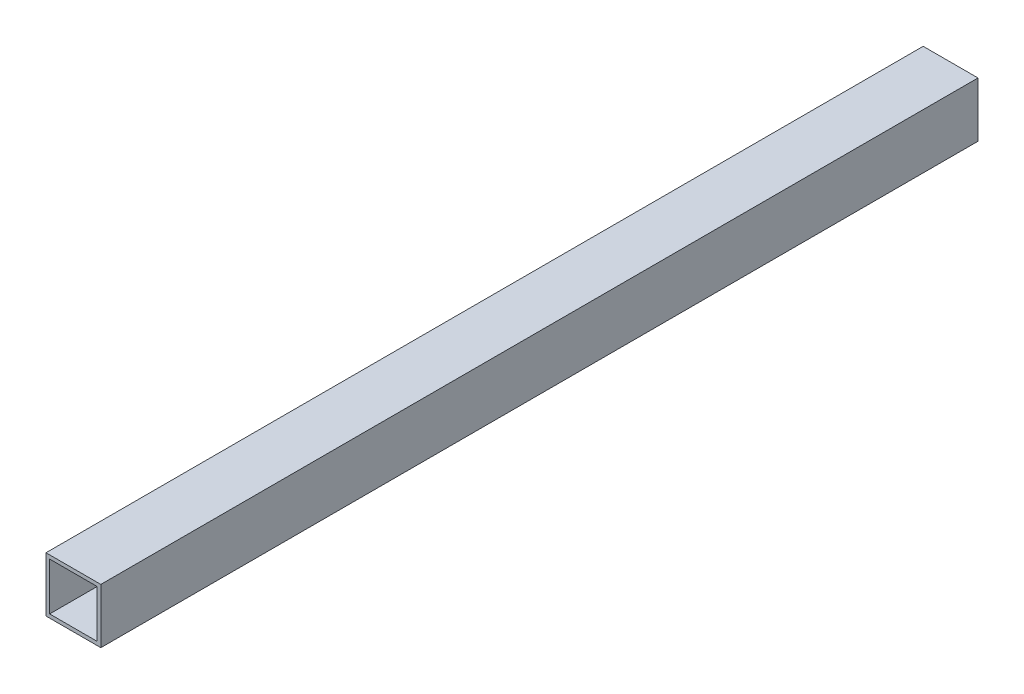
ISO-10303-21;
HEADER;
FILE_DESCRIPTION(('STEP AP214'),'2;1');
FILE_NAME('part.step','',(''),(''),'','','');
FILE_SCHEMA(('AUTOMOTIVE_DESIGN { 1 0 10303 214 1 1 1 1 }'));
ENDSEC;
DATA;
#1=APPLICATION_CONTEXT('core data for automotive mechanical design processes');
#2=APPLICATION_PROTOCOL_DEFINITION('international standard','automotive_design',2000,#1);
#3=PRODUCT_CONTEXT('',#1,'mechanical');
#4=PRODUCT('Part','Part','',(#3));
#5=PRODUCT_RELATED_PRODUCT_CATEGORY('part','',(#4));
#6=PRODUCT_DEFINITION_FORMATION('','',#4);
#7=PRODUCT_DEFINITION_CONTEXT('part definition',#1,'design');
#8=PRODUCT_DEFINITION('design','',#6,#7);
#9=PRODUCT_DEFINITION_SHAPE('','',#8);
#10=(LENGTH_UNIT() NAMED_UNIT(*) SI_UNIT(.MILLI.,.METRE.));
#11=(NAMED_UNIT(*) PLANE_ANGLE_UNIT() SI_UNIT($,.RADIAN.));
#12=(NAMED_UNIT(*) SI_UNIT($,.STERADIAN.) SOLID_ANGLE_UNIT());
#13=UNCERTAINTY_MEASURE_WITH_UNIT(LENGTH_MEASURE(1.E-05),#10,'distance_accuracy_value','');
#14=(GEOMETRIC_REPRESENTATION_CONTEXT(3) GLOBAL_UNCERTAINTY_ASSIGNED_CONTEXT((#13)) GLOBAL_UNIT_ASSIGNED_CONTEXT((#10,
#11,#12)) REPRESENTATION_CONTEXT('',''));
#15=CARTESIAN_POINT('',(0.,0.,0.));
#16=DIRECTION('',(0.,0.,1.));
#17=DIRECTION('',(1.,0.,0.));
#18=AXIS2_PLACEMENT_3D('',#15,#16,#17);
#19=CARTESIAN_POINT('',(9.525,-9.525,-1524.));
#20=DIRECTION('',(0.,0.,1.));
#21=DIRECTION('',(1.,0.,0.));
#22=AXIS2_PLACEMENT_3D('',#19,#20,#21);
#23=PLANE('',#22);
#24=DIRECTION('',(0.,1.,0.));
#25=VECTOR('',#24,1.);
#26=CARTESIAN_POINT('',(9.525,9.525,-1524.));
#27=LINE('',#26,#25);
#28=CARTESIAN_POINT('',(9.525,-9.525,-1524.));
#29=VERTEX_POINT('',#28);
#30=CARTESIAN_POINT('',(9.525,9.525,-1524.));
#31=VERTEX_POINT('',#30);
#32=EDGE_CURVE('E135',#29,#31,#27,.T.);
#33=ORIENTED_EDGE('',*,*,#32,.F.);
#34=DIRECTION('',(1.,0.,0.));
#35=VECTOR('',#34,1.);
#36=CARTESIAN_POINT('',(-9.525,-9.525,-1524.));
#37=LINE('',#36,#35);
#38=CARTESIAN_POINT('',(-9.525,-9.525,-1524.));
#39=VERTEX_POINT('',#38);
#40=EDGE_CURVE('E129',#39,#29,#37,.T.);
#41=ORIENTED_EDGE('',*,*,#40,.F.);
#42=DIRECTION('',(0.,-1.,0.));
#43=VECTOR('',#42,1.);
#44=CARTESIAN_POINT('',(-9.525,9.525,-1524.));
#45=LINE('',#44,#43);
#46=CARTESIAN_POINT('',(-9.525,9.525,-1524.));
#47=VERTEX_POINT('',#46);
#48=EDGE_CURVE('E132',#47,#39,#45,.T.);
#49=ORIENTED_EDGE('',*,*,#48,.F.);
#50=DIRECTION('',(-1.,0.,0.));
#51=VECTOR('',#50,1.);
#52=CARTESIAN_POINT('',(-9.525,9.525,-1524.));
#53=LINE('',#52,#51);
#54=EDGE_CURVE('E122',#31,#47,#53,.T.);
#55=ORIENTED_EDGE('',*,*,#54,.F.);
#56=EDGE_LOOP('',(#33,#41,#49,#55));
#57=FACE_BOUND('',#56,.T.);
#58=DIRECTION('',(0.,1.,0.));
#59=VECTOR('',#58,1.);
#60=CARTESIAN_POINT('',(8.255,8.255,-1524.));
#61=LINE('',#60,#59);
#62=CARTESIAN_POINT('',(8.255,-8.255,-1524.));
#63=VERTEX_POINT('',#62);
#64=CARTESIAN_POINT('',(8.255,8.255,-1524.));
#65=VERTEX_POINT('',#64);
#66=EDGE_CURVE('E155',#63,#65,#61,.T.);
#67=ORIENTED_EDGE('',*,*,#66,.T.);
#68=DIRECTION('',(-1.,0.,0.));
#69=VECTOR('',#68,1.);
#70=CARTESIAN_POINT('',(-8.255,8.255,-1524.));
#71=LINE('',#70,#69);
#72=CARTESIAN_POINT('',(-8.255,8.255,-1524.));
#73=VERTEX_POINT('',#72);
#74=EDGE_CURVE('E152',#65,#73,#71,.T.);
#75=ORIENTED_EDGE('',*,*,#74,.T.);
#76=DIRECTION('',(0.,-1.,0.));
#77=VECTOR('',#76,1.);
#78=CARTESIAN_POINT('',(-8.255,8.255,-1524.));
#79=LINE('',#78,#77);
#80=CARTESIAN_POINT('',(-8.255,-8.255,-1524.));
#81=VERTEX_POINT('',#80);
#82=EDGE_CURVE('E149',#73,#81,#79,.T.);
#83=ORIENTED_EDGE('',*,*,#82,.T.);
#84=DIRECTION('',(1.,0.,0.));
#85=VECTOR('',#84,1.);
#86=CARTESIAN_POINT('',(-8.255,-8.255,-1524.));
#87=LINE('',#86,#85);
#88=EDGE_CURVE('E146',#81,#63,#87,.T.);
#89=ORIENTED_EDGE('',*,*,#88,.T.);
#90=EDGE_LOOP('',(#67,#75,#83,#89));
#91=FACE_BOUND('',#90,.T.);
#92=ADVANCED_FACE('F40',(#57,#91),#23,.F.);
#93=CARTESIAN_POINT('',(9.525,9.525,1524.));
#94=DIRECTION('',(-1.,0.,0.));
#95=DIRECTION('',(0.,0.,1.));
#96=AXIS2_PLACEMENT_3D('',#93,#94,#95);
#97=PLANE('',#96);
#98=DIRECTION('',(0.,0.,-1.));
#99=VECTOR('',#98,1.);
#100=CARTESIAN_POINT('',(9.525,9.525,1524.));
#101=LINE('',#100,#99);
#102=CARTESIAN_POINT('',(9.525,9.525,-1219.2));
#103=VERTEX_POINT('',#102);
#104=EDGE_CURVE('E48',#103,#31,#101,.T.);
#105=ORIENTED_EDGE('',*,*,#104,.F.);
#106=DIRECTION('',(0.,1.,0.));
#107=VECTOR('',#106,1.);
#108=CARTESIAN_POINT('',(9.525,-9.525,-1219.2));
#109=LINE('',#108,#107);
#110=CARTESIAN_POINT('',(9.525,-9.525,-1219.2));
#111=VERTEX_POINT('',#110);
#112=EDGE_CURVE('E105',#111,#103,#109,.T.);
#113=ORIENTED_EDGE('',*,*,#112,.F.);
#114=DIRECTION('',(0.,0.,-1.));
#115=VECTOR('',#114,1.);
#116=CARTESIAN_POINT('',(9.525,-9.525,1524.));
#117=LINE('',#116,#115);
#118=EDGE_CURVE('E125',#111,#29,#117,.T.);
#119=ORIENTED_EDGE('',*,*,#118,.T.);
#120=ORIENTED_EDGE('',*,*,#32,.T.);
#121=EDGE_LOOP('',(#105,#113,#119,#120));
#122=FACE_BOUND('',#121,.T.);
#123=ADVANCED_FACE('F42',(#122),#97,.F.);
#124=CARTESIAN_POINT('',(-9.525,9.525,1524.));
#125=DIRECTION('',(0.,-1.,0.));
#126=DIRECTION('',(0.,0.,-1.));
#127=AXIS2_PLACEMENT_3D('',#124,#125,#126);
#128=PLANE('',#127);
#129=DIRECTION('',(0.,0.,-1.));
#130=VECTOR('',#129,1.);
#131=CARTESIAN_POINT('',(-9.525,9.525,1524.));
#132=LINE('',#131,#130);
#133=CARTESIAN_POINT('',(-9.525,9.525,-1219.2));
#134=VERTEX_POINT('',#133);
#135=EDGE_CURVE('E116',#134,#47,#132,.T.);
#136=ORIENTED_EDGE('',*,*,#135,.F.);
#137=DIRECTION('',(1.,0.,0.));
#138=VECTOR('',#137,1.);
#139=CARTESIAN_POINT('',(-9.525,9.525,-1219.2));
#140=LINE('',#139,#138);
#141=EDGE_CURVE('E102',#134,#103,#140,.T.);
#142=ORIENTED_EDGE('',*,*,#141,.T.);
#143=ORIENTED_EDGE('',*,*,#104,.T.);
#144=ORIENTED_EDGE('',*,*,#54,.T.);
#145=EDGE_LOOP('',(#136,#142,#143,#144));
#146=FACE_BOUND('',#145,.T.);
#147=ADVANCED_FACE('F120',(#146),#128,.F.);
#148=CARTESIAN_POINT('',(-9.525,9.525,1524.));
#149=DIRECTION('',(1.,0.,0.));
#150=DIRECTION('',(0.,1.,0.));
#151=AXIS2_PLACEMENT_3D('',#148,#149,#150);
#152=PLANE('',#151);
#153=DIRECTION('',(0.,0.,-1.));
#154=VECTOR('',#153,1.);
#155=CARTESIAN_POINT('',(-9.525,-9.525,1524.));
#156=LINE('',#155,#154);
#157=CARTESIAN_POINT('',(-9.525,-9.525,-1219.2));
#158=VERTEX_POINT('',#157);
#159=EDGE_CURVE('E118',#158,#39,#156,.T.);
#160=ORIENTED_EDGE('',*,*,#159,.F.);
#161=DIRECTION('',(0.,1.,0.));
#162=VECTOR('',#161,1.);
#163=CARTESIAN_POINT('',(-9.525,-9.525,-1219.2));
#164=LINE('',#163,#162);
#165=EDGE_CURVE('E55',#158,#134,#164,.T.);
#166=ORIENTED_EDGE('',*,*,#165,.T.);
#167=ORIENTED_EDGE('',*,*,#135,.T.);
#168=ORIENTED_EDGE('',*,*,#48,.T.);
#169=EDGE_LOOP('',(#160,#166,#167,#168));
#170=FACE_BOUND('',#169,.T.);
#171=ADVANCED_FACE('F114',(#170),#152,.F.);
#172=CARTESIAN_POINT('',(-9.525,-9.525,1524.));
#173=DIRECTION('',(0.,1.,0.));
#174=DIRECTION('',(0.,0.,1.));
#175=AXIS2_PLACEMENT_3D('',#172,#173,#174);
#176=PLANE('',#175);
#177=ORIENTED_EDGE('',*,*,#118,.F.);
#178=DIRECTION('',(1.,0.,0.));
#179=VECTOR('',#178,1.);
#180=CARTESIAN_POINT('',(-9.525,-9.525,-1219.2));
#181=LINE('',#180,#179);
#182=EDGE_CURVE('E110',#158,#111,#181,.T.);
#183=ORIENTED_EDGE('',*,*,#182,.F.);
#184=ORIENTED_EDGE('',*,*,#159,.T.);
#185=ORIENTED_EDGE('',*,*,#40,.T.);
#186=EDGE_LOOP('',(#177,#183,#184,#185));
#187=FACE_BOUND('',#186,.T.);
#188=ADVANCED_FACE('F166',(#187),#176,.F.);
#189=CARTESIAN_POINT('',(8.255,8.255,1524.));
#190=DIRECTION('',(-1.,0.,0.));
#191=DIRECTION('',(0.,0.,1.));
#192=AXIS2_PLACEMENT_3D('',#189,#190,#191);
#193=PLANE('',#192);
#194=DIRECTION('',(0.,-1.,0.));
#195=VECTOR('',#194,1.);
#196=CARTESIAN_POINT('',(8.255,8.255,-1219.2));
#197=LINE('',#196,#195);
#198=CARTESIAN_POINT('',(8.255,8.255,-1219.2));
#199=VERTEX_POINT('',#198);
#200=CARTESIAN_POINT('',(8.255,-8.255,-1219.2));
#201=VERTEX_POINT('',#200);
#202=EDGE_CURVE('E62',#199,#201,#197,.T.);
#203=ORIENTED_EDGE('',*,*,#202,.F.);
#204=DIRECTION('',(0.,0.,-1.));
#205=VECTOR('',#204,1.);
#206=CARTESIAN_POINT('',(8.255,8.255,1524.));
#207=LINE('',#206,#205);
#208=EDGE_CURVE('E138',#199,#65,#207,.T.);
#209=ORIENTED_EDGE('',*,*,#208,.T.);
#210=ORIENTED_EDGE('',*,*,#66,.F.);
#211=DIRECTION('',(0.,0.,-1.));
#212=VECTOR('',#211,1.);
#213=CARTESIAN_POINT('',(8.255,-8.255,1524.));
#214=LINE('',#213,#212);
#215=EDGE_CURVE('E144',#201,#63,#214,.T.);
#216=ORIENTED_EDGE('',*,*,#215,.F.);
#217=EDGE_LOOP('',(#203,#209,#210,#216));
#218=FACE_BOUND('',#217,.T.);
#219=ADVANCED_FACE('F178',(#218),#193,.T.);
#220=CARTESIAN_POINT('',(-8.255,8.255,1524.));
#221=DIRECTION('',(0.,-1.,0.));
#222=DIRECTION('',(0.,0.,-1.));
#223=AXIS2_PLACEMENT_3D('',#220,#221,#222);
#224=PLANE('',#223);
#225=DIRECTION('',(1.,0.,0.));
#226=VECTOR('',#225,1.);
#227=CARTESIAN_POINT('',(-8.255,8.255,-1219.2));
#228=LINE('',#227,#226);
#229=CARTESIAN_POINT('',(-8.255,8.255,-1219.2));
#230=VERTEX_POINT('',#229);
#231=EDGE_CURVE('E159',#230,#199,#228,.T.);
#232=ORIENTED_EDGE('',*,*,#231,.F.);
#233=DIRECTION('',(0.,0.,-1.));
#234=VECTOR('',#233,1.);
#235=CARTESIAN_POINT('',(-8.255,8.255,1524.));
#236=LINE('',#235,#234);
#237=EDGE_CURVE('E140',#230,#73,#236,.T.);
#238=ORIENTED_EDGE('',*,*,#237,.T.);
#239=ORIENTED_EDGE('',*,*,#74,.F.);
#240=ORIENTED_EDGE('',*,*,#208,.F.);
#241=EDGE_LOOP('',(#232,#238,#239,#240));
#242=FACE_BOUND('',#241,.T.);
#243=ADVANCED_FACE('F182',(#242),#224,.T.);
#244=CARTESIAN_POINT('',(-8.255,8.255,1524.));
#245=DIRECTION('',(1.,0.,0.));
#246=DIRECTION('',(0.,0.,-1.));
#247=AXIS2_PLACEMENT_3D('',#244,#245,#246);
#248=PLANE('',#247);
#249=DIRECTION('',(0.,1.,0.));
#250=VECTOR('',#249,1.);
#251=CARTESIAN_POINT('',(-8.255,8.255,-1219.2));
#252=LINE('',#251,#250);
#253=CARTESIAN_POINT('',(-8.255,-8.255,-1219.2));
#254=VERTEX_POINT('',#253);
#255=EDGE_CURVE('E109',#254,#230,#252,.T.);
#256=ORIENTED_EDGE('',*,*,#255,.F.);
#257=DIRECTION('',(0.,0.,-1.));
#258=VECTOR('',#257,1.);
#259=CARTESIAN_POINT('',(-8.255,-8.255,1524.));
#260=LINE('',#259,#258);
#261=EDGE_CURVE('E142',#254,#81,#260,.T.);
#262=ORIENTED_EDGE('',*,*,#261,.T.);
#263=ORIENTED_EDGE('',*,*,#82,.F.);
#264=ORIENTED_EDGE('',*,*,#237,.F.);
#265=EDGE_LOOP('',(#256,#262,#263,#264));
#266=FACE_BOUND('',#265,.T.);
#267=ADVANCED_FACE('F187',(#266),#248,.T.);
#268=CARTESIAN_POINT('',(-8.255,-8.255,1524.));
#269=DIRECTION('',(0.,1.,0.));
#270=DIRECTION('',(0.,0.,1.));
#271=AXIS2_PLACEMENT_3D('',#268,#269,#270);
#272=PLANE('',#271);
#273=DIRECTION('',(-1.,0.,0.));
#274=VECTOR('',#273,1.);
#275=CARTESIAN_POINT('',(-8.255,-8.255,-1219.2));
#276=LINE('',#275,#274);
#277=EDGE_CURVE('E11',#201,#254,#276,.T.);
#278=ORIENTED_EDGE('',*,*,#277,.F.);
#279=ORIENTED_EDGE('',*,*,#215,.T.);
#280=ORIENTED_EDGE('',*,*,#88,.F.);
#281=ORIENTED_EDGE('',*,*,#261,.F.);
#282=EDGE_LOOP('',(#278,#279,#280,#281));
#283=FACE_BOUND('',#282,.T.);
#284=ADVANCED_FACE('F190',(#283),#272,.T.);
#285=CARTESIAN_POINT('',(-9.525,-9.525,-1219.2));
#286=DIRECTION('',(0.,0.,-1.));
#287=DIRECTION('',(-1.,0.,0.));
#288=AXIS2_PLACEMENT_3D('',#285,#286,#287);
#289=PLANE('',#288);
#290=ORIENTED_EDGE('',*,*,#202,.T.);
#291=ORIENTED_EDGE('',*,*,#277,.T.);
#292=ORIENTED_EDGE('',*,*,#255,.T.);
#293=ORIENTED_EDGE('',*,*,#231,.T.);
#294=EDGE_LOOP('',(#290,#291,#292,#293));
#295=FACE_BOUND('',#294,.T.);
#296=ORIENTED_EDGE('',*,*,#112,.T.);
#297=ORIENTED_EDGE('',*,*,#141,.F.);
#298=ORIENTED_EDGE('',*,*,#165,.F.);
#299=ORIENTED_EDGE('',*,*,#182,.T.);
#300=EDGE_LOOP('',(#296,#297,#298,#299));
#301=FACE_BOUND('',#300,.T.);
#302=ADVANCED_FACE('F103',(#295,#301),#289,.F.);
#303=CLOSED_SHELL('',(#92,#123,#147,#171,#188,#219,#243,#267,#284,#302));
#304=MANIFOLD_SOLID_BREP('B2',#303);
#305=ADVANCED_BREP_SHAPE_REPRESENTATION('',(#18,#304),#14);
#306=SHAPE_DEFINITION_REPRESENTATION(#9,#305);
ENDSEC;
END-ISO-10303-21;
